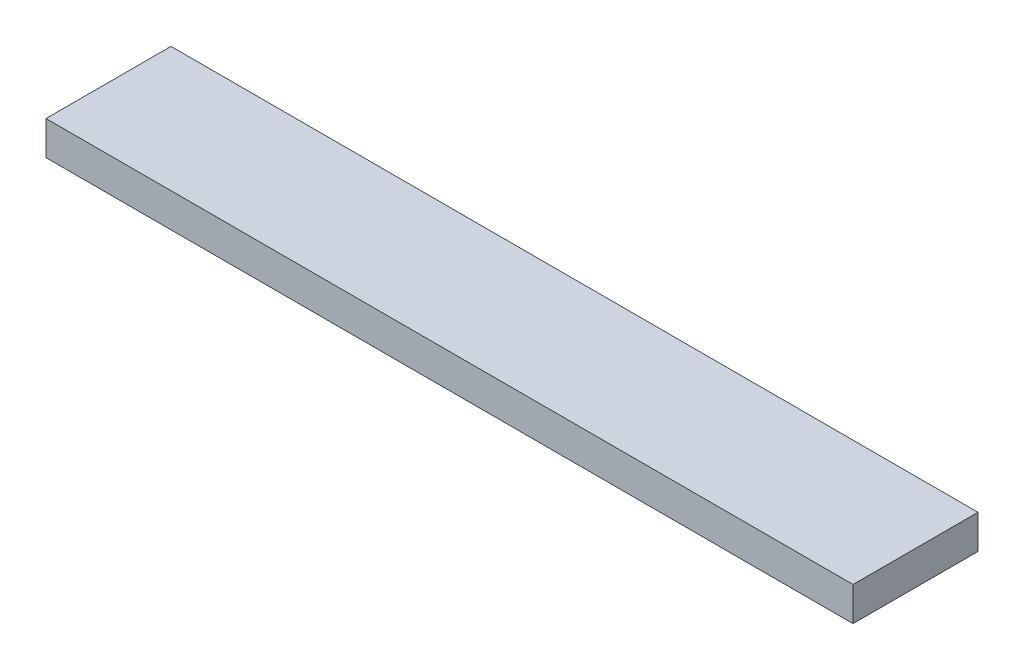
ISO-10303-21;
HEADER;
FILE_DESCRIPTION(('STEP AP214'),'2;1');
FILE_NAME('part.step','',(''),(''),'','','');
FILE_SCHEMA(('AUTOMOTIVE_DESIGN { 1 0 10303 214 1 1 1 1 }'));
ENDSEC;
DATA;
#1=APPLICATION_CONTEXT('core data for automotive mechanical design processes');
#2=APPLICATION_PROTOCOL_DEFINITION('international standard','automotive_design',2000,#1);
#3=PRODUCT_CONTEXT('',#1,'mechanical');
#4=PRODUCT('Part','Part','',(#3));
#5=PRODUCT_RELATED_PRODUCT_CATEGORY('part','',(#4));
#6=PRODUCT_DEFINITION_FORMATION('','',#4);
#7=PRODUCT_DEFINITION_CONTEXT('part definition',#1,'design');
#8=PRODUCT_DEFINITION('design','',#6,#7);
#9=PRODUCT_DEFINITION_SHAPE('','',#8);
#10=(LENGTH_UNIT() NAMED_UNIT(*) SI_UNIT(.MILLI.,.METRE.));
#11=(NAMED_UNIT(*) PLANE_ANGLE_UNIT() SI_UNIT($,.RADIAN.));
#12=(NAMED_UNIT(*) SI_UNIT($,.STERADIAN.) SOLID_ANGLE_UNIT());
#13=UNCERTAINTY_MEASURE_WITH_UNIT(LENGTH_MEASURE(1.E-05),#10,'distance_accuracy_value','');
#14=(GEOMETRIC_REPRESENTATION_CONTEXT(3) GLOBAL_UNCERTAINTY_ASSIGNED_CONTEXT((#13)) GLOBAL_UNIT_ASSIGNED_CONTEXT((#10,
#11,#12)) REPRESENTATION_CONTEXT('',''));
#15=CARTESIAN_POINT('',(0.,0.,0.));
#16=DIRECTION('',(0.,0.,1.));
#17=DIRECTION('',(1.,0.,0.));
#18=AXIS2_PLACEMENT_3D('',#15,#16,#17);
#19=CARTESIAN_POINT('',(0.,9.5,0.));
#20=DIRECTION('',(1.,0.,0.));
#21=DIRECTION('',(0.,0.,-1.));
#22=AXIS2_PLACEMENT_3D('',#19,#20,#21);
#23=PLANE('',#22);
#24=DIRECTION('',(0.,0.,1.));
#25=VECTOR('',#24,1.);
#26=CARTESIAN_POINT('',(0.,0.,0.));
#27=LINE('',#26,#25);
#28=CARTESIAN_POINT('',(0.,0.,0.));
#29=VERTEX_POINT('',#28);
#30=CARTESIAN_POINT('',(0.,0.,35.));
#31=VERTEX_POINT('',#30);
#32=EDGE_CURVE('E98',#29,#31,#27,.T.);
#33=ORIENTED_EDGE('',*,*,#32,.T.);
#34=DIRECTION('',(0.,-1.,0.));
#35=VECTOR('',#34,1.);
#36=CARTESIAN_POINT('',(0.,9.5,35.));
#37=LINE('',#36,#35);
#38=CARTESIAN_POINT('',(0.,9.5,35.));
#39=VERTEX_POINT('',#38);
#40=EDGE_CURVE('E11',#39,#31,#37,.T.);
#41=ORIENTED_EDGE('',*,*,#40,.F.);
#42=DIRECTION('',(0.,0.,1.));
#43=VECTOR('',#42,1.);
#44=CARTESIAN_POINT('',(0.,9.5,0.));
#45=LINE('',#44,#43);
#46=CARTESIAN_POINT('',(0.,9.5,0.));
#47=VERTEX_POINT('',#46);
#48=EDGE_CURVE('E86',#47,#39,#45,.T.);
#49=ORIENTED_EDGE('',*,*,#48,.F.);
#50=DIRECTION('',(0.,-1.,0.));
#51=VECTOR('',#50,1.);
#52=CARTESIAN_POINT('',(0.,9.5,0.));
#53=LINE('',#52,#51);
#54=EDGE_CURVE('E94',#47,#29,#53,.T.);
#55=ORIENTED_EDGE('',*,*,#54,.T.);
#56=EDGE_LOOP('',(#33,#41,#49,#55));
#57=FACE_BOUND('',#56,.T.);
#58=ADVANCED_FACE('F35',(#57),#23,.F.);
#59=CARTESIAN_POINT('',(0.,9.5,35.));
#60=DIRECTION('',(0.,0.,-1.));
#61=DIRECTION('',(-1.,0.,0.));
#62=AXIS2_PLACEMENT_3D('',#59,#60,#61);
#63=PLANE('',#62);
#64=DIRECTION('',(1.,0.,0.));
#65=VECTOR('',#64,1.);
#66=CARTESIAN_POINT('',(0.,0.,35.));
#67=LINE('',#66,#65);
#68=CARTESIAN_POINT('',(226.,0.,35.));
#69=VERTEX_POINT('',#68);
#70=EDGE_CURVE('E90',#31,#69,#67,.T.);
#71=ORIENTED_EDGE('',*,*,#70,.T.);
#72=DIRECTION('',(0.,-1.,0.));
#73=VECTOR('',#72,1.);
#74=CARTESIAN_POINT('',(226.,9.5,35.));
#75=LINE('',#74,#73);
#76=CARTESIAN_POINT('',(226.,9.5,35.));
#77=VERTEX_POINT('',#76);
#78=EDGE_CURVE('E43',#77,#69,#75,.T.);
#79=ORIENTED_EDGE('',*,*,#78,.F.);
#80=DIRECTION('',(1.,0.,0.));
#81=VECTOR('',#80,1.);
#82=CARTESIAN_POINT('',(0.,9.5,35.));
#83=LINE('',#82,#81);
#84=EDGE_CURVE('E81',#39,#77,#83,.T.);
#85=ORIENTED_EDGE('',*,*,#84,.F.);
#86=ORIENTED_EDGE('',*,*,#40,.T.);
#87=EDGE_LOOP('',(#71,#79,#85,#86));
#88=FACE_BOUND('',#87,.T.);
#89=ADVANCED_FACE('F89',(#88),#63,.F.);
#90=CARTESIAN_POINT('',(226.,9.5,0.));
#91=DIRECTION('',(-1.,0.,0.));
#92=DIRECTION('',(0.,0.,1.));
#93=AXIS2_PLACEMENT_3D('',#90,#91,#92);
#94=PLANE('',#93);
#95=DIRECTION('',(0.,0.,-1.));
#96=VECTOR('',#95,1.);
#97=CARTESIAN_POINT('',(226.,0.,0.));
#98=LINE('',#97,#96);
#99=CARTESIAN_POINT('',(226.,0.,0.));
#100=VERTEX_POINT('',#99);
#101=EDGE_CURVE('E68',#69,#100,#98,.T.);
#102=ORIENTED_EDGE('',*,*,#101,.T.);
#103=DIRECTION('',(0.,-1.,0.));
#104=VECTOR('',#103,1.);
#105=CARTESIAN_POINT('',(226.,9.5,0.));
#106=LINE('',#105,#104);
#107=CARTESIAN_POINT('',(226.,9.5,0.));
#108=VERTEX_POINT('',#107);
#109=EDGE_CURVE('E91',#108,#100,#106,.T.);
#110=ORIENTED_EDGE('',*,*,#109,.F.);
#111=DIRECTION('',(0.,0.,-1.));
#112=VECTOR('',#111,1.);
#113=CARTESIAN_POINT('',(226.,9.5,0.));
#114=LINE('',#113,#112);
#115=EDGE_CURVE('E84',#77,#108,#114,.T.);
#116=ORIENTED_EDGE('',*,*,#115,.F.);
#117=ORIENTED_EDGE('',*,*,#78,.T.);
#118=EDGE_LOOP('',(#102,#110,#116,#117));
#119=FACE_BOUND('',#118,.T.);
#120=ADVANCED_FACE('F92',(#119),#94,.F.);
#121=CARTESIAN_POINT('',(0.,9.5,0.));
#122=DIRECTION('',(0.,0.,1.));
#123=DIRECTION('',(1.,0.,0.));
#124=AXIS2_PLACEMENT_3D('',#121,#122,#123);
#125=PLANE('',#124);
#126=DIRECTION('',(-1.,0.,0.));
#127=VECTOR('',#126,1.);
#128=CARTESIAN_POINT('',(0.,0.,0.));
#129=LINE('',#128,#127);
#130=EDGE_CURVE('E74',#100,#29,#129,.T.);
#131=ORIENTED_EDGE('',*,*,#130,.T.);
#132=ORIENTED_EDGE('',*,*,#54,.F.);
#133=DIRECTION('',(-1.,0.,0.));
#134=VECTOR('',#133,1.);
#135=CARTESIAN_POINT('',(0.,9.5,0.));
#136=LINE('',#135,#134);
#137=EDGE_CURVE('E51',#108,#47,#136,.T.);
#138=ORIENTED_EDGE('',*,*,#137,.F.);
#139=ORIENTED_EDGE('',*,*,#109,.T.);
#140=EDGE_LOOP('',(#131,#132,#138,#139));
#141=FACE_BOUND('',#140,.T.);
#142=ADVANCED_FACE('F105',(#141),#125,.F.);
#143=CARTESIAN_POINT('',(0.,9.5,0.));
#144=DIRECTION('',(0.,1.,0.));
#145=DIRECTION('',(0.,0.,1.));
#146=AXIS2_PLACEMENT_3D('',#143,#144,#145);
#147=PLANE('',#146);
#148=ORIENTED_EDGE('',*,*,#48,.T.);
#149=ORIENTED_EDGE('',*,*,#84,.T.);
#150=ORIENTED_EDGE('',*,*,#115,.T.);
#151=ORIENTED_EDGE('',*,*,#137,.T.);
#152=EDGE_LOOP('',(#148,#149,#150,#151));
#153=FACE_BOUND('',#152,.T.);
#154=ADVANCED_FACE('F82',(#153),#147,.T.);
#155=CARTESIAN_POINT('',(0.,0.,0.));
#156=DIRECTION('',(0.,1.,0.));
#157=DIRECTION('',(0.,0.,1.));
#158=AXIS2_PLACEMENT_3D('',#155,#156,#157);
#159=PLANE('',#158);
#160=ORIENTED_EDGE('',*,*,#32,.F.);
#161=ORIENTED_EDGE('',*,*,#130,.F.);
#162=ORIENTED_EDGE('',*,*,#101,.F.);
#163=ORIENTED_EDGE('',*,*,#70,.F.);
#164=EDGE_LOOP('',(#160,#161,#162,#163));
#165=FACE_BOUND('',#164,.T.);
#166=ADVANCED_FACE('F108',(#165),#159,.F.);
#167=CLOSED_SHELL('',(#58,#89,#120,#142,#154,#166));
#168=MANIFOLD_SOLID_BREP('B2',#167);
#169=ADVANCED_BREP_SHAPE_REPRESENTATION('',(#18,#168),#14);
#170=SHAPE_DEFINITION_REPRESENTATION(#9,#169);
ENDSEC;
END-ISO-10303-21;
